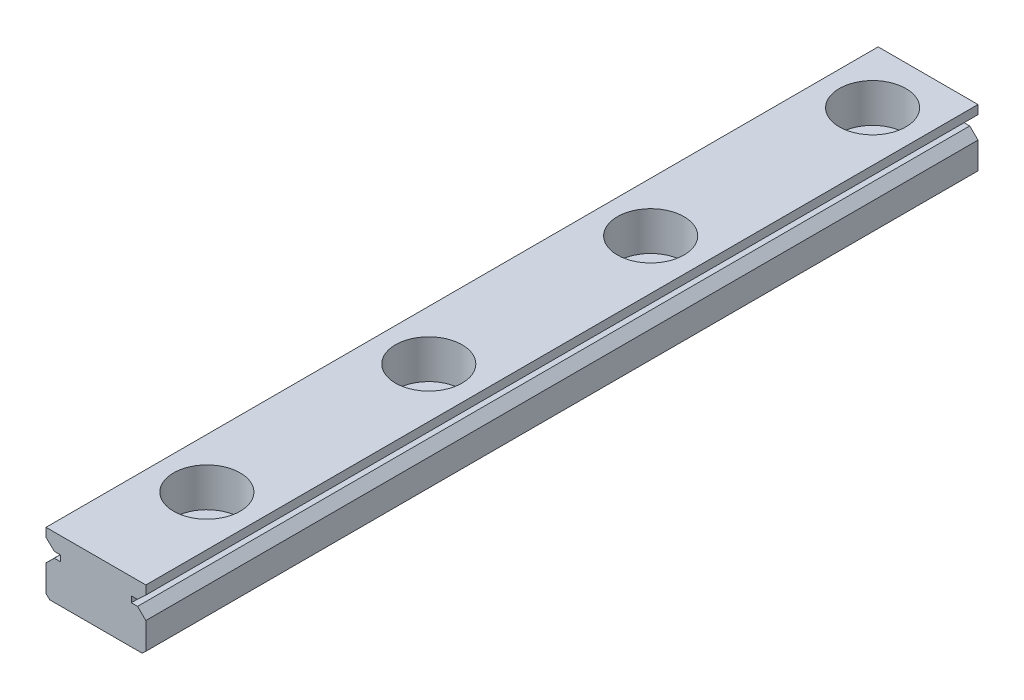
ISO-10303-21;
HEADER;
FILE_DESCRIPTION(('STEP AP214'),'2;1');
FILE_NAME('part.step','',(''),(''),'','','');
FILE_SCHEMA(('AUTOMOTIVE_DESIGN { 1 0 10303 214 1 1 1 1 }'));
ENDSEC;
DATA;
#1=APPLICATION_CONTEXT('core data for automotive mechanical design processes');
#2=APPLICATION_PROTOCOL_DEFINITION('international standard','automotive_design',2000,#1);
#3=PRODUCT_CONTEXT('',#1,'mechanical');
#4=PRODUCT('Part','Part','',(#3));
#5=PRODUCT_RELATED_PRODUCT_CATEGORY('part','',(#4));
#6=PRODUCT_DEFINITION_FORMATION('','',#4);
#7=PRODUCT_DEFINITION_CONTEXT('part definition',#1,'design');
#8=PRODUCT_DEFINITION('design','',#6,#7);
#9=PRODUCT_DEFINITION_SHAPE('','',#8);
#10=(LENGTH_UNIT() NAMED_UNIT(*) SI_UNIT(.MILLI.,.METRE.));
#11=(NAMED_UNIT(*) PLANE_ANGLE_UNIT() SI_UNIT($,.RADIAN.));
#12=(NAMED_UNIT(*) SI_UNIT($,.STERADIAN.) SOLID_ANGLE_UNIT());
#13=UNCERTAINTY_MEASURE_WITH_UNIT(LENGTH_MEASURE(1.E-05),#10,'distance_accuracy_value','');
#14=(GEOMETRIC_REPRESENTATION_CONTEXT(3) GLOBAL_UNCERTAINTY_ASSIGNED_CONTEXT((#13)) GLOBAL_UNIT_ASSIGNED_CONTEXT((#10,
#11,#12)) REPRESENTATION_CONTEXT('',''));
#15=CARTESIAN_POINT('',(0.,0.,0.));
#16=DIRECTION('',(0.,0.,1.));
#17=DIRECTION('',(1.,0.,0.));
#18=AXIS2_PLACEMENT_3D('',#15,#16,#17);
#19=CARTESIAN_POINT('',(0.,60.3558438126425,75.));
#20=DIRECTION('',(0.,-1.,0.));
#21=DIRECTION('',(0.,0.,-1.));
#22=AXIS2_PLACEMENT_3D('',#19,#20,#21);
#23=PLANE('',#22);
#24=CARTESIAN_POINT('',(176.62288373964,60.3558438126425,5.));
#25=DIRECTION('',(0.,1.,0.));
#26=DIRECTION('',(0.,0.,1.));
#27=AXIS2_PLACEMENT_3D('',#24,#25,#26);
#28=CIRCLE('',#27,3.);
#29=CARTESIAN_POINT('',(176.62288373964,60.3558438126425,8.));
#30=VERTEX_POINT('',#29);
#31=EDGE_CURVE('E352',#30,#30,#28,.T.);
#32=ORIENTED_EDGE('',*,*,#31,.F.);
#33=EDGE_LOOP('',(#32));
#34=FACE_BOUND('',#33,.T.);
#35=CARTESIAN_POINT('',(176.62288373964,60.3558438126425,25.));
#36=DIRECTION('',(0.,1.,0.));
#37=DIRECTION('',(0.,0.,1.));
#38=AXIS2_PLACEMENT_3D('',#35,#36,#37);
#39=CIRCLE('',#38,3.);
#40=CARTESIAN_POINT('',(176.62288373964,60.3558438126425,28.));
#41=VERTEX_POINT('',#40);
#42=EDGE_CURVE('E353',#41,#41,#39,.T.);
#43=ORIENTED_EDGE('',*,*,#42,.F.);
#44=EDGE_LOOP('',(#43));
#45=FACE_BOUND('',#44,.T.);
#46=CARTESIAN_POINT('',(176.62288373964,60.3558438126425,45.));
#47=DIRECTION('',(0.,1.,0.));
#48=DIRECTION('',(0.,0.,1.));
#49=AXIS2_PLACEMENT_3D('',#46,#47,#48);
#50=CIRCLE('',#49,3.);
#51=CARTESIAN_POINT('',(176.62288373964,60.3558438126425,48.));
#52=VERTEX_POINT('',#51);
#53=EDGE_CURVE('E360',#52,#52,#50,.T.);
#54=ORIENTED_EDGE('',*,*,#53,.F.);
#55=EDGE_LOOP('',(#54));
#56=FACE_BOUND('',#55,.T.);
#57=CARTESIAN_POINT('',(176.62288373964,60.3558438126425,65.));
#58=DIRECTION('',(0.,1.,0.));
#59=DIRECTION('',(0.,0.,1.));
#60=AXIS2_PLACEMENT_3D('',#57,#58,#59);
#61=CIRCLE('',#60,3.);
#62=CARTESIAN_POINT('',(176.62288373964,60.3558438126425,68.));
#63=VERTEX_POINT('',#62);
#64=EDGE_CURVE('E365',#63,#63,#61,.T.);
#65=ORIENTED_EDGE('',*,*,#64,.F.);
#66=EDGE_LOOP('',(#65));
#67=FACE_BOUND('',#66,.T.);
#68=DIRECTION('',(-1.,0.,0.));
#69=VECTOR('',#68,1.);
#70=CARTESIAN_POINT('',(0.,60.3558438126425,0.));
#71=LINE('',#70,#69);
#72=CARTESIAN_POINT('',(181.122753743396,60.3558438126425,0.));
#73=VERTEX_POINT('',#72);
#74=CARTESIAN_POINT('',(172.123013735885,60.3558438126425,0.));
#75=VERTEX_POINT('',#74);
#76=EDGE_CURVE('E191',#73,#75,#71,.T.);
#77=ORIENTED_EDGE('',*,*,#76,.T.);
#78=DIRECTION('',(0.,0.,-1.));
#79=VECTOR('',#78,1.);
#80=CARTESIAN_POINT('',(172.123013735885,60.3558438126425,75.));
#81=LINE('',#80,#79);
#82=CARTESIAN_POINT('',(172.123013735885,60.3558438126425,75.));
#83=VERTEX_POINT('',#82);
#84=EDGE_CURVE('E11',#83,#75,#81,.T.);
#85=ORIENTED_EDGE('',*,*,#84,.F.);
#86=DIRECTION('',(-1.,0.,0.));
#87=VECTOR('',#86,1.);
#88=CARTESIAN_POINT('',(0.,60.3558438126425,75.));
#89=LINE('',#88,#87);
#90=CARTESIAN_POINT('',(181.122753743396,60.3558438126425,75.));
#91=VERTEX_POINT('',#90);
#92=EDGE_CURVE('E123',#91,#83,#89,.T.);
#93=ORIENTED_EDGE('',*,*,#92,.F.);
#94=DIRECTION('',(0.,0.,-1.));
#95=VECTOR('',#94,1.);
#96=CARTESIAN_POINT('',(181.122753743396,60.3558438126425,75.));
#97=LINE('',#96,#95);
#98=EDGE_CURVE('E188',#91,#73,#97,.T.);
#99=ORIENTED_EDGE('',*,*,#98,.T.);
#100=EDGE_LOOP('',(#77,#85,#93,#99));
#101=FACE_BOUND('',#100,.T.);
#102=ADVANCED_FACE('F39',(#34,#45,#56,#67,#101),#23,.F.);
#103=CARTESIAN_POINT('',(172.123013735885,0.,75.));
#104=DIRECTION('',(-1.,0.,0.));
#105=DIRECTION('',(0.,0.,1.));
#106=AXIS2_PLACEMENT_3D('',#103,#104,#105);
#107=PLANE('',#106);
#108=DIRECTION('',(0.,1.,0.));
#109=VECTOR('',#108,1.);
#110=CARTESIAN_POINT('',(172.123013735885,0.,0.));
#111=LINE('',#110,#109);
#112=CARTESIAN_POINT('',(172.123013735885,59.5630289463369,0.));
#113=VERTEX_POINT('',#112);
#114=EDGE_CURVE('E197',#113,#75,#111,.T.);
#115=ORIENTED_EDGE('',*,*,#114,.F.);
#116=DIRECTION('',(0.,0.,-1.));
#117=VECTOR('',#116,1.);
#118=CARTESIAN_POINT('',(172.123013735885,59.5630289463369,75.));
#119=LINE('',#118,#117);
#120=CARTESIAN_POINT('',(172.123013735885,59.5630289463369,75.));
#121=VERTEX_POINT('',#120);
#122=EDGE_CURVE('E50',#121,#113,#119,.T.);
#123=ORIENTED_EDGE('',*,*,#122,.F.);
#124=DIRECTION('',(0.,1.,0.));
#125=VECTOR('',#124,1.);
#126=CARTESIAN_POINT('',(172.123013735885,0.,75.));
#127=LINE('',#126,#125);
#128=EDGE_CURVE('E288',#121,#83,#127,.T.);
#129=ORIENTED_EDGE('',*,*,#128,.T.);
#130=ORIENTED_EDGE('',*,*,#84,.T.);
#131=EDGE_LOOP('',(#115,#123,#129,#130));
#132=FACE_BOUND('',#131,.T.);
#133=ADVANCED_FACE('F280',(#132),#107,.T.);
#134=CARTESIAN_POINT('',(110.707011310501,117.452037908747,75.));
#135=DIRECTION('',(-0.685903044724634,-0.727692938839918,0.));
#136=DIRECTION('',(0.727692938839918,-0.685903044724634,0.));
#137=AXIS2_PLACEMENT_3D('',#134,#135,#136);
#138=PLANE('',#137);
#139=DIRECTION('',(-0.727692938839918,0.685903044724634,0.));
#140=VECTOR('',#139,1.);
#141=CARTESIAN_POINT('',(110.707011310501,117.452037908747,0.));
#142=LINE('',#141,#140);
#143=CARTESIAN_POINT('',(172.878991896515,58.8504650413625,0.));
#144=VERTEX_POINT('',#143);
#145=EDGE_CURVE('E204',#144,#113,#142,.T.);
#146=ORIENTED_EDGE('',*,*,#145,.F.);
#147=DIRECTION('',(0.,0.,-1.));
#148=VECTOR('',#147,1.);
#149=CARTESIAN_POINT('',(172.878991896515,58.8504650413625,75.));
#150=LINE('',#149,#148);
#151=CARTESIAN_POINT('',(172.878991896515,58.8504650413625,75.));
#152=VERTEX_POINT('',#151);
#153=EDGE_CURVE('E266',#152,#144,#150,.T.);
#154=ORIENTED_EDGE('',*,*,#153,.F.);
#155=DIRECTION('',(-0.727692938839918,0.685903044724634,0.));
#156=VECTOR('',#155,1.);
#157=CARTESIAN_POINT('',(110.707011310501,117.452037908747,75.));
#158=LINE('',#157,#156);
#159=EDGE_CURVE('E274',#152,#121,#158,.T.);
#160=ORIENTED_EDGE('',*,*,#159,.T.);
#161=ORIENTED_EDGE('',*,*,#122,.T.);
#162=EDGE_LOOP('',(#146,#154,#160,#161));
#163=FACE_BOUND('',#162,.T.);
#164=ADVANCED_FACE('F275',(#163),#138,.T.);
#165=CARTESIAN_POINT('',(0.,58.8504650413625,75.));
#166=DIRECTION('',(0.,-1.,0.));
#167=DIRECTION('',(0.,0.,-1.));
#168=AXIS2_PLACEMENT_3D('',#165,#166,#167);
#169=PLANE('',#168);
#170=DIRECTION('',(-1.,0.,0.));
#171=VECTOR('',#170,1.);
#172=CARTESIAN_POINT('',(0.,58.8504650413625,0.));
#173=LINE('',#172,#171);
#174=CARTESIAN_POINT('',(173.430975950309,58.8504650413625,0.));
#175=VERTEX_POINT('',#174);
#176=EDGE_CURVE('E203',#175,#144,#173,.T.);
#177=ORIENTED_EDGE('',*,*,#176,.F.);
#178=DIRECTION('',(0.,0.,-1.));
#179=VECTOR('',#178,1.);
#180=CARTESIAN_POINT('',(173.430975950309,58.8504650413625,75.));
#181=LINE('',#180,#179);
#182=CARTESIAN_POINT('',(173.430975950309,58.8504650413625,75.));
#183=VERTEX_POINT('',#182);
#184=EDGE_CURVE('E265',#183,#175,#181,.T.);
#185=ORIENTED_EDGE('',*,*,#184,.F.);
#186=DIRECTION('',(-1.,0.,0.));
#187=VECTOR('',#186,1.);
#188=CARTESIAN_POINT('',(0.,58.8504650413625,75.));
#189=LINE('',#188,#187);
#190=EDGE_CURVE('E290',#183,#152,#189,.T.);
#191=ORIENTED_EDGE('',*,*,#190,.T.);
#192=ORIENTED_EDGE('',*,*,#153,.T.);
#193=EDGE_LOOP('',(#177,#185,#191,#192));
#194=FACE_BOUND('',#193,.T.);
#195=ADVANCED_FACE('F283',(#194),#169,.T.);
#196=CARTESIAN_POINT('',(173.430975950309,0.,75.));
#197=DIRECTION('',(-1.,0.,0.));
#198=DIRECTION('',(0.,0.,1.));
#199=AXIS2_PLACEMENT_3D('',#196,#197,#198);
#200=PLANE('',#199);
#201=DIRECTION('',(0.,1.,0.));
#202=VECTOR('',#201,1.);
#203=CARTESIAN_POINT('',(173.430975950309,0.,0.));
#204=LINE('',#203,#202);
#205=CARTESIAN_POINT('',(173.430975950309,58.3136633089681,0.));
#206=VERTEX_POINT('',#205);
#207=EDGE_CURVE('E210',#206,#175,#204,.T.);
#208=ORIENTED_EDGE('',*,*,#207,.F.);
#209=DIRECTION('',(0.,0.,-1.));
#210=VECTOR('',#209,1.);
#211=CARTESIAN_POINT('',(173.430975950309,58.3136633089681,75.));
#212=LINE('',#211,#210);
#213=CARTESIAN_POINT('',(173.430975950309,58.3136633089681,75.));
#214=VERTEX_POINT('',#213);
#215=EDGE_CURVE('E264',#214,#206,#212,.T.);
#216=ORIENTED_EDGE('',*,*,#215,.F.);
#217=DIRECTION('',(0.,1.,0.));
#218=VECTOR('',#217,1.);
#219=CARTESIAN_POINT('',(173.430975950309,0.,75.));
#220=LINE('',#219,#218);
#221=EDGE_CURVE('E292',#214,#183,#220,.T.);
#222=ORIENTED_EDGE('',*,*,#221,.T.);
#223=ORIENTED_EDGE('',*,*,#184,.T.);
#224=EDGE_LOOP('',(#208,#216,#222,#223));
#225=FACE_BOUND('',#224,.T.);
#226=ADVANCED_FACE('F413',(#225),#200,.T.);
#227=CARTESIAN_POINT('',(0.,58.3136633089681,75.));
#228=DIRECTION('',(0.,1.,0.));
#229=DIRECTION('',(0.,0.,1.));
#230=AXIS2_PLACEMENT_3D('',#227,#228,#229);
#231=PLANE('',#230);
#232=DIRECTION('',(1.,0.,0.));
#233=VECTOR('',#232,1.);
#234=CARTESIAN_POINT('',(0.,58.3136633089681,0.));
#235=LINE('',#234,#233);
#236=CARTESIAN_POINT('',(172.866992243172,58.3136633089681,0.));
#237=VERTEX_POINT('',#236);
#238=EDGE_CURVE('E208',#237,#206,#235,.T.);
#239=ORIENTED_EDGE('',*,*,#238,.F.);
#240=DIRECTION('',(0.,0.,-1.));
#241=VECTOR('',#240,1.);
#242=CARTESIAN_POINT('',(172.866992243172,58.3136633089681,75.));
#243=LINE('',#242,#241);
#244=CARTESIAN_POINT('',(172.866992243172,58.3136633089681,75.));
#245=VERTEX_POINT('',#244);
#246=EDGE_CURVE('E261',#245,#237,#243,.T.);
#247=ORIENTED_EDGE('',*,*,#246,.F.);
#248=DIRECTION('',(1.,0.,0.));
#249=VECTOR('',#248,1.);
#250=CARTESIAN_POINT('',(0.,58.3136633089681,75.));
#251=LINE('',#250,#249);
#252=EDGE_CURVE('E296',#245,#214,#251,.T.);
#253=ORIENTED_EDGE('',*,*,#252,.T.);
#254=ORIENTED_EDGE('',*,*,#215,.T.);
#255=EDGE_LOOP('',(#239,#247,#253,#254));
#256=FACE_BOUND('',#255,.T.);
#257=ADVANCED_FACE('F411',(#256),#231,.T.);
#258=CARTESIAN_POINT('',(56.2293907047499,-56.9162890040398,75.));
#259=DIRECTION('',(-0.702801041807441,0.711386460114596,0.));
#260=DIRECTION('',(-0.711386460114596,-0.702801041807441,0.));
#261=AXIS2_PLACEMENT_3D('',#258,#259,#260);
#262=PLANE('',#261);
#263=DIRECTION('',(0.711386460114596,0.702801041807441,0.));
#264=VECTOR('',#263,1.);
#265=CARTESIAN_POINT('',(56.2293907047499,-56.9162890040398,0.));
#266=LINE('',#265,#264);
#267=CARTESIAN_POINT('',(172.123013735885,57.5786635594371,0.));
#268=VERTEX_POINT('',#267);
#269=EDGE_CURVE('E214',#268,#237,#266,.T.);
#270=ORIENTED_EDGE('',*,*,#269,.F.);
#271=DIRECTION('',(0.,0.,-1.));
#272=VECTOR('',#271,1.);
#273=CARTESIAN_POINT('',(172.123013735885,57.5786635594371,75.));
#274=LINE('',#273,#272);
#275=CARTESIAN_POINT('',(172.123013735885,57.5786635594371,75.));
#276=VERTEX_POINT('',#275);
#277=EDGE_CURVE('E256',#276,#268,#274,.T.);
#278=ORIENTED_EDGE('',*,*,#277,.F.);
#279=DIRECTION('',(0.711386460114596,0.702801041807441,0.));
#280=VECTOR('',#279,1.);
#281=CARTESIAN_POINT('',(56.2293907047499,-56.9162890040398,75.));
#282=LINE('',#281,#280);
#283=EDGE_CURVE('E301',#276,#245,#282,.T.);
#284=ORIENTED_EDGE('',*,*,#283,.T.);
#285=ORIENTED_EDGE('',*,*,#246,.T.);
#286=EDGE_LOOP('',(#270,#278,#284,#285));
#287=FACE_BOUND('',#286,.T.);
#288=ADVANCED_FACE('F409',(#287),#262,.T.);
#289=CARTESIAN_POINT('',(172.123013735885,0.,75.));
#290=DIRECTION('',(-1.,0.,0.));
#291=DIRECTION('',(0.,0.,1.));
#292=AXIS2_PLACEMENT_3D('',#289,#290,#291);
#293=PLANE('',#292);
#294=DIRECTION('',(0.,1.,0.));
#295=VECTOR('',#294,1.);
#296=CARTESIAN_POINT('',(172.123013735885,0.,0.));
#297=LINE('',#296,#295);
#298=CARTESIAN_POINT('',(172.123013735885,55.1745401347487,0.));
#299=VERTEX_POINT('',#298);
#300=EDGE_CURVE('E216',#299,#268,#297,.T.);
#301=ORIENTED_EDGE('',*,*,#300,.F.);
#302=DIRECTION('',(0.,0.,-1.));
#303=VECTOR('',#302,1.);
#304=CARTESIAN_POINT('',(172.123013735885,55.1745401347487,75.));
#305=LINE('',#304,#303);
#306=CARTESIAN_POINT('',(172.123013735885,55.1745401347487,75.));
#307=VERTEX_POINT('',#306);
#308=EDGE_CURVE('E260',#307,#299,#305,.T.);
#309=ORIENTED_EDGE('',*,*,#308,.F.);
#310=DIRECTION('',(0.,1.,0.));
#311=VECTOR('',#310,1.);
#312=CARTESIAN_POINT('',(172.123013735885,0.,75.));
#313=LINE('',#312,#311);
#314=EDGE_CURVE('E302',#307,#276,#313,.T.);
#315=ORIENTED_EDGE('',*,*,#314,.T.);
#316=ORIENTED_EDGE('',*,*,#277,.T.);
#317=EDGE_LOOP('',(#301,#309,#315,#316));
#318=FACE_BOUND('',#317,.T.);
#319=ADVANCED_FACE('F403',(#318),#293,.T.);
#320=CARTESIAN_POINT('',(105.735463596551,115.794842649279,75.));
#321=DIRECTION('',(0.674303230167207,0.738454571240554,0.));
#322=DIRECTION('',(-0.738454571240554,0.674303230167207,0.));
#323=AXIS2_PLACEMENT_3D('',#320,#321,#322);
#324=PLANE('',#323);
#325=DIRECTION('',(0.738454571240554,-0.674303230167207,0.));
#326=VECTOR('',#325,1.);
#327=CARTESIAN_POINT('',(105.735463596551,115.794842649279,0.));
#328=LINE('',#327,#326);
#329=CARTESIAN_POINT('',(172.467003798394,54.8604333239455,0.));
#330=VERTEX_POINT('',#329);
#331=EDGE_CURVE('E218',#299,#330,#328,.T.);
#332=ORIENTED_EDGE('',*,*,#331,.T.);
#333=DIRECTION('',(0.,0.,-1.));
#334=VECTOR('',#333,1.);
#335=CARTESIAN_POINT('',(172.467003798394,54.8604333239455,75.));
#336=LINE('',#335,#334);
#337=CARTESIAN_POINT('',(172.467003798394,54.8604333239455,75.));
#338=VERTEX_POINT('',#337);
#339=EDGE_CURVE('E253',#338,#330,#336,.T.);
#340=ORIENTED_EDGE('',*,*,#339,.F.);
#341=DIRECTION('',(0.738454571240554,-0.674303230167207,0.));
#342=VECTOR('',#341,1.);
#343=CARTESIAN_POINT('',(105.735463596551,115.794842649279,75.));
#344=LINE('',#343,#342);
#345=EDGE_CURVE('E310',#307,#338,#344,.T.);
#346=ORIENTED_EDGE('',*,*,#345,.F.);
#347=ORIENTED_EDGE('',*,*,#308,.T.);
#348=EDGE_LOOP('',(#332,#340,#346,#347));
#349=FACE_BOUND('',#348,.T.);
#350=ADVANCED_FACE('F383',(#349),#324,.F.);
#351=CARTESIAN_POINT('',(0.,54.8604333239455,75.));
#352=DIRECTION('',(0.,-1.,0.));
#353=DIRECTION('',(0.,0.,-1.));
#354=AXIS2_PLACEMENT_3D('',#351,#352,#353);
#355=PLANE('',#354);
#356=CARTESIAN_POINT('',(176.62288373964,54.8604333239455,5.));
#357=DIRECTION('',(0.,-1.,0.));
#358=DIRECTION('',(0.,0.,-1.));
#359=AXIS2_PLACEMENT_3D('',#356,#357,#358);
#360=CIRCLE('',#359,1.75);
#361=CARTESIAN_POINT('',(176.62288373964,54.8604333239455,3.25));
#362=VERTEX_POINT('',#361);
#363=EDGE_CURVE('E655',#362,#362,#360,.T.);
#364=ORIENTED_EDGE('',*,*,#363,.F.);
#365=EDGE_LOOP('',(#364));
#366=FACE_BOUND('',#365,.T.);
#367=CARTESIAN_POINT('',(176.62288373964,54.8604333239455,25.));
#368=DIRECTION('',(0.,-1.,0.));
#369=DIRECTION('',(0.,0.,-1.));
#370=AXIS2_PLACEMENT_3D('',#367,#368,#369);
#371=CIRCLE('',#370,1.75);
#372=CARTESIAN_POINT('',(176.62288373964,54.8604333239455,23.25));
#373=VERTEX_POINT('',#372);
#374=EDGE_CURVE('E663',#373,#373,#371,.T.);
#375=ORIENTED_EDGE('',*,*,#374,.F.);
#376=EDGE_LOOP('',(#375));
#377=FACE_BOUND('',#376,.T.);
#378=CARTESIAN_POINT('',(176.62288373964,54.8604333239455,45.));
#379=DIRECTION('',(0.,-1.,0.));
#380=DIRECTION('',(0.,0.,-1.));
#381=AXIS2_PLACEMENT_3D('',#378,#379,#380);
#382=CIRCLE('',#381,1.75);
#383=CARTESIAN_POINT('',(176.62288373964,54.8604333239455,43.25));
#384=VERTEX_POINT('',#383);
#385=EDGE_CURVE('E362',#384,#384,#382,.T.);
#386=ORIENTED_EDGE('',*,*,#385,.F.);
#387=EDGE_LOOP('',(#386));
#388=FACE_BOUND('',#387,.T.);
#389=CARTESIAN_POINT('',(176.62288373964,54.8604333239455,65.));
#390=DIRECTION('',(0.,-1.,0.));
#391=DIRECTION('',(0.,0.,-1.));
#392=AXIS2_PLACEMENT_3D('',#389,#390,#391);
#393=CIRCLE('',#392,1.75);
#394=CARTESIAN_POINT('',(176.62288373964,54.8604333239455,63.25));
#395=VERTEX_POINT('',#394);
#396=EDGE_CURVE('E199',#395,#395,#393,.T.);
#397=ORIENTED_EDGE('',*,*,#396,.F.);
#398=EDGE_LOOP('',(#397));
#399=FACE_BOUND('',#398,.T.);
#400=DIRECTION('',(-1.,0.,0.));
#401=VECTOR('',#400,1.);
#402=CARTESIAN_POINT('',(0.,54.8604333239455,0.));
#403=LINE('',#402,#401);
#404=CARTESIAN_POINT('',(180.778763680886,54.8604333239455,0.));
#405=VERTEX_POINT('',#404);
#406=EDGE_CURVE('E225',#405,#330,#403,.T.);
#407=ORIENTED_EDGE('',*,*,#406,.F.);
#408=DIRECTION('',(0.,0.,-1.));
#409=VECTOR('',#408,1.);
#410=CARTESIAN_POINT('',(180.778763680886,54.8604333239455,75.));
#411=LINE('',#410,#409);
#412=CARTESIAN_POINT('',(180.778763680886,54.8604333239455,75.));
#413=VERTEX_POINT('',#412);
#414=EDGE_CURVE('E254',#413,#405,#411,.T.);
#415=ORIENTED_EDGE('',*,*,#414,.F.);
#416=DIRECTION('',(-1.,0.,0.));
#417=VECTOR('',#416,1.);
#418=CARTESIAN_POINT('',(0.,54.8604333239455,75.));
#419=LINE('',#418,#417);
#420=EDGE_CURVE('E307',#413,#338,#419,.T.);
#421=ORIENTED_EDGE('',*,*,#420,.T.);
#422=ORIENTED_EDGE('',*,*,#339,.T.);
#423=EDGE_LOOP('',(#407,#415,#421,#422));
#424=FACE_BOUND('',#423,.T.);
#425=ADVANCED_FACE('F385',(#366,#377,#388,#399,#424),#355,.T.);
#426=CARTESIAN_POINT('',(54.880033865487,-60.101168235181,75.));
#427=DIRECTION('',(0.674303230167207,-0.738454571240554,0.));
#428=DIRECTION('',(0.738454571240554,0.674303230167207,0.));
#429=AXIS2_PLACEMENT_3D('',#426,#427,#428);
#430=PLANE('',#429);
#431=DIRECTION('',(-0.738454571240554,-0.674303230167207,0.));
#432=VECTOR('',#431,1.);
#433=CARTESIAN_POINT('',(54.880033865487,-60.101168235181,0.));
#434=LINE('',#433,#432);
#435=CARTESIAN_POINT('',(181.122753743396,55.1745401347487,0.));
#436=VERTEX_POINT('',#435);
#437=EDGE_CURVE('E223',#436,#405,#434,.T.);
#438=ORIENTED_EDGE('',*,*,#437,.F.);
#439=DIRECTION('',(0.,0.,-1.));
#440=VECTOR('',#439,1.);
#441=CARTESIAN_POINT('',(181.122753743396,55.1745401347487,75.));
#442=LINE('',#441,#440);
#443=CARTESIAN_POINT('',(181.122753743396,55.1745401347487,75.));
#444=VERTEX_POINT('',#443);
#445=EDGE_CURVE('E252',#444,#436,#442,.T.);
#446=ORIENTED_EDGE('',*,*,#445,.F.);
#447=DIRECTION('',(-0.738454571240554,-0.674303230167207,0.));
#448=VECTOR('',#447,1.);
#449=CARTESIAN_POINT('',(54.880033865487,-60.101168235181,75.));
#450=LINE('',#449,#448);
#451=EDGE_CURVE('E315',#444,#413,#450,.T.);
#452=ORIENTED_EDGE('',*,*,#451,.T.);
#453=ORIENTED_EDGE('',*,*,#414,.T.);
#454=EDGE_LOOP('',(#438,#446,#452,#453));
#455=FACE_BOUND('',#454,.T.);
#456=ADVANCED_FACE('F381',(#455),#430,.T.);
#457=CARTESIAN_POINT('',(181.122753743396,0.,75.));
#458=DIRECTION('',(-1.,0.,0.));
#459=DIRECTION('',(0.,0.,1.));
#460=AXIS2_PLACEMENT_3D('',#457,#458,#459);
#461=PLANE('',#460);
#462=DIRECTION('',(0.,1.,0.));
#463=VECTOR('',#462,1.);
#464=CARTESIAN_POINT('',(181.122753743396,0.,0.));
#465=LINE('',#464,#463);
#466=CARTESIAN_POINT('',(181.122753743396,57.5786635594371,0.));
#467=VERTEX_POINT('',#466);
#468=EDGE_CURVE('E226',#436,#467,#465,.T.);
#469=ORIENTED_EDGE('',*,*,#468,.T.);
#470=DIRECTION('',(0.,0.,-1.));
#471=VECTOR('',#470,1.);
#472=CARTESIAN_POINT('',(181.122753743396,57.5786635594371,75.));
#473=LINE('',#472,#471);
#474=CARTESIAN_POINT('',(181.122753743396,57.5786635594371,75.));
#475=VERTEX_POINT('',#474);
#476=EDGE_CURVE('E247',#475,#467,#473,.T.);
#477=ORIENTED_EDGE('',*,*,#476,.F.);
#478=DIRECTION('',(0.,1.,0.));
#479=VECTOR('',#478,1.);
#480=CARTESIAN_POINT('',(181.122753743396,0.,75.));
#481=LINE('',#480,#479);
#482=EDGE_CURVE('E314',#444,#475,#481,.T.);
#483=ORIENTED_EDGE('',*,*,#482,.F.);
#484=ORIENTED_EDGE('',*,*,#445,.T.);
#485=EDGE_LOOP('',(#469,#477,#483,#484));
#486=FACE_BOUND('',#485,.T.);
#487=ADVANCED_FACE('F475',(#486),#461,.F.);
#488=CARTESIAN_POINT('',(118.249294646824,119.693500080728,75.));
#489=DIRECTION('',(-0.702802016691502,-0.711385496994673,0.));
#490=DIRECTION('',(0.711385496994673,-0.702802016691502,0.));
#491=AXIS2_PLACEMENT_3D('',#488,#489,#490);
#492=PLANE('',#491);
#493=DIRECTION('',(-0.711385496994673,0.702802016691502,0.));
#494=VECTOR('',#493,1.);
#495=CARTESIAN_POINT('',(118.249294646824,119.693500080728,0.));
#496=LINE('',#495,#494);
#497=CARTESIAN_POINT('',(180.378777275353,58.3136633089681,0.));
#498=VERTEX_POINT('',#497);
#499=EDGE_CURVE('E229',#467,#498,#496,.T.);
#500=ORIENTED_EDGE('',*,*,#499,.T.);
#501=DIRECTION('',(0.,0.,-1.));
#502=VECTOR('',#501,1.);
#503=CARTESIAN_POINT('',(180.378777275353,58.3136633089681,75.));
#504=LINE('',#503,#502);
#505=CARTESIAN_POINT('',(180.378777275353,58.3136633089681,75.));
#506=VERTEX_POINT('',#505);
#507=EDGE_CURVE('E244',#506,#498,#504,.T.);
#508=ORIENTED_EDGE('',*,*,#507,.F.);
#509=DIRECTION('',(-0.711385496994673,0.702802016691502,0.));
#510=VECTOR('',#509,1.);
#511=CARTESIAN_POINT('',(118.249294646824,119.693500080728,75.));
#512=LINE('',#511,#510);
#513=EDGE_CURVE('E320',#475,#506,#512,.T.);
#514=ORIENTED_EDGE('',*,*,#513,.F.);
#515=ORIENTED_EDGE('',*,*,#476,.T.);
#516=EDGE_LOOP('',(#500,#508,#514,#515));
#517=FACE_BOUND('',#516,.T.);
#518=ADVANCED_FACE('F478',(#517),#492,.F.);
#519=CARTESIAN_POINT('',(0.,58.3136633089681,75.));
#520=DIRECTION('',(0.,-1.,0.));
#521=DIRECTION('',(0.,0.,-1.));
#522=AXIS2_PLACEMENT_3D('',#519,#520,#521);
#523=PLANE('',#522);
#524=DIRECTION('',(-1.,0.,0.));
#525=VECTOR('',#524,1.);
#526=CARTESIAN_POINT('',(0.,58.3136633089681,0.));
#527=LINE('',#526,#525);
#528=CARTESIAN_POINT('',(179.81479152897,58.3136633089681,0.));
#529=VERTEX_POINT('',#528);
#530=EDGE_CURVE('E235',#498,#529,#527,.T.);
#531=ORIENTED_EDGE('',*,*,#530,.T.);
#532=DIRECTION('',(0.,0.,-1.));
#533=VECTOR('',#532,1.);
#534=CARTESIAN_POINT('',(179.81479152897,58.3136633089681,75.));
#535=LINE('',#534,#533);
#536=CARTESIAN_POINT('',(179.81479152897,58.3136633089681,75.));
#537=VERTEX_POINT('',#536);
#538=EDGE_CURVE('E245',#537,#529,#535,.T.);
#539=ORIENTED_EDGE('',*,*,#538,.F.);
#540=DIRECTION('',(-1.,0.,0.));
#541=VECTOR('',#540,1.);
#542=CARTESIAN_POINT('',(0.,58.3136633089681,75.));
#543=LINE('',#542,#541);
#544=EDGE_CURVE('E316',#506,#537,#543,.T.);
#545=ORIENTED_EDGE('',*,*,#544,.F.);
#546=ORIENTED_EDGE('',*,*,#507,.T.);
#547=EDGE_LOOP('',(#531,#539,#545,#546));
#548=FACE_BOUND('',#547,.T.);
#549=ADVANCED_FACE('F323',(#548),#523,.F.);
#550=CARTESIAN_POINT('',(179.81479152897,0.,75.));
#551=DIRECTION('',(-1.,0.,0.));
#552=DIRECTION('',(0.,0.,1.));
#553=AXIS2_PLACEMENT_3D('',#550,#551,#552);
#554=PLANE('',#553);
#555=DIRECTION('',(0.,1.,0.));
#556=VECTOR('',#555,1.);
#557=CARTESIAN_POINT('',(179.81479152897,0.,0.));
#558=LINE('',#557,#556);
#559=CARTESIAN_POINT('',(179.81479152897,58.8504650413625,0.));
#560=VERTEX_POINT('',#559);
#561=EDGE_CURVE('E234',#529,#560,#558,.T.);
#562=ORIENTED_EDGE('',*,*,#561,.T.);
#563=DIRECTION('',(0.,0.,-1.));
#564=VECTOR('',#563,1.);
#565=CARTESIAN_POINT('',(179.81479152897,58.8504650413625,75.));
#566=LINE('',#565,#564);
#567=CARTESIAN_POINT('',(179.81479152897,58.8504650413625,75.));
#568=VERTEX_POINT('',#567);
#569=EDGE_CURVE('E184',#568,#560,#566,.T.);
#570=ORIENTED_EDGE('',*,*,#569,.F.);
#571=DIRECTION('',(0.,1.,0.));
#572=VECTOR('',#571,1.);
#573=CARTESIAN_POINT('',(179.81479152897,0.,75.));
#574=LINE('',#573,#572);
#575=EDGE_CURVE('E176',#537,#568,#574,.T.);
#576=ORIENTED_EDGE('',*,*,#575,.F.);
#577=ORIENTED_EDGE('',*,*,#538,.T.);
#578=EDGE_LOOP('',(#562,#570,#576,#577));
#579=FACE_BOUND('',#578,.T.);
#580=ADVANCED_FACE('F328',(#579),#554,.F.);
#581=CARTESIAN_POINT('',(0.,58.8504650413625,75.));
#582=DIRECTION('',(0.,1.,0.));
#583=DIRECTION('',(0.,0.,1.));
#584=AXIS2_PLACEMENT_3D('',#581,#582,#583);
#585=PLANE('',#584);
#586=DIRECTION('',(1.,0.,0.));
#587=VECTOR('',#586,1.);
#588=CARTESIAN_POINT('',(0.,58.8504650413625,0.));
#589=LINE('',#588,#587);
#590=CARTESIAN_POINT('',(180.366775582764,58.8504650413625,0.));
#591=VERTEX_POINT('',#590);
#592=EDGE_CURVE('E183',#560,#591,#589,.T.);
#593=ORIENTED_EDGE('',*,*,#592,.T.);
#594=DIRECTION('',(0.,0.,-1.));
#595=VECTOR('',#594,1.);
#596=CARTESIAN_POINT('',(180.366775582764,58.8504650413625,75.));
#597=LINE('',#596,#595);
#598=CARTESIAN_POINT('',(180.366775582764,58.8504650413625,75.));
#599=VERTEX_POINT('',#598);
#600=EDGE_CURVE('E181',#599,#591,#597,.T.);
#601=ORIENTED_EDGE('',*,*,#600,.F.);
#602=DIRECTION('',(1.,0.,0.));
#603=VECTOR('',#602,1.);
#604=CARTESIAN_POINT('',(0.,58.8504650413625,75.));
#605=LINE('',#604,#603);
#606=EDGE_CURVE('E167',#568,#599,#605,.T.);
#607=ORIENTED_EDGE('',*,*,#606,.F.);
#608=ORIENTED_EDGE('',*,*,#569,.T.);
#609=EDGE_LOOP('',(#593,#601,#607,#608));
#610=FACE_BOUND('',#609,.T.);
#611=ADVANCED_FACE('F185',(#610),#585,.F.);
#612=CARTESIAN_POINT('',(55.4820475190048,-58.8623924656534,75.));
#613=DIRECTION('',(-0.685903044724567,0.727692938839981,0.));
#614=DIRECTION('',(-0.727692938839981,-0.685903044724567,0.));
#615=AXIS2_PLACEMENT_3D('',#612,#613,#614);
#616=PLANE('',#615);
#617=DIRECTION('',(0.727692938839981,0.685903044724567,0.));
#618=VECTOR('',#617,1.);
#619=CARTESIAN_POINT('',(55.4820475190048,-58.8623924656534,0.));
#620=LINE('',#619,#618);
#621=CARTESIAN_POINT('',(181.122753743396,59.5630289463369,0.));
#622=VERTEX_POINT('',#621);
#623=EDGE_CURVE('E113',#591,#622,#620,.T.);
#624=ORIENTED_EDGE('',*,*,#623,.T.);
#625=DIRECTION('',(0.,0.,-1.));
#626=VECTOR('',#625,1.);
#627=CARTESIAN_POINT('',(181.122753743396,59.5630289463369,75.));
#628=LINE('',#627,#626);
#629=CARTESIAN_POINT('',(181.122753743396,59.5630289463369,75.));
#630=VERTEX_POINT('',#629);
#631=EDGE_CURVE('E187',#630,#622,#628,.T.);
#632=ORIENTED_EDGE('',*,*,#631,.F.);
#633=DIRECTION('',(0.727692938839981,0.685903044724567,0.));
#634=VECTOR('',#633,1.);
#635=CARTESIAN_POINT('',(55.4820475190048,-58.8623924656534,75.));
#636=LINE('',#635,#634);
#637=EDGE_CURVE('E172',#599,#630,#636,.T.);
#638=ORIENTED_EDGE('',*,*,#637,.F.);
#639=ORIENTED_EDGE('',*,*,#600,.T.);
#640=EDGE_LOOP('',(#624,#632,#638,#639));
#641=FACE_BOUND('',#640,.T.);
#642=ADVANCED_FACE('F189',(#641),#616,.F.);
#643=CARTESIAN_POINT('',(181.122753743396,0.,75.));
#644=DIRECTION('',(-1.,0.,0.));
#645=DIRECTION('',(0.,0.,1.));
#646=AXIS2_PLACEMENT_3D('',#643,#644,#645);
#647=PLANE('',#646);
#648=DIRECTION('',(0.,1.,0.));
#649=VECTOR('',#648,1.);
#650=CARTESIAN_POINT('',(181.122753743396,0.,0.));
#651=LINE('',#650,#649);
#652=EDGE_CURVE('E118',#622,#73,#651,.T.);
#653=ORIENTED_EDGE('',*,*,#652,.T.);
#654=ORIENTED_EDGE('',*,*,#98,.F.);
#655=DIRECTION('',(0.,1.,0.));
#656=VECTOR('',#655,1.);
#657=CARTESIAN_POINT('',(181.122753743396,0.,75.));
#658=LINE('',#657,#656);
#659=EDGE_CURVE('E54',#630,#91,#658,.T.);
#660=ORIENTED_EDGE('',*,*,#659,.F.);
#661=ORIENTED_EDGE('',*,*,#631,.T.);
#662=EDGE_LOOP('',(#653,#654,#660,#661));
#663=FACE_BOUND('',#662,.T.);
#664=ADVANCED_FACE('F334',(#663),#647,.F.);
#665=CARTESIAN_POINT('',(0.,0.,75.));
#666=DIRECTION('',(0.,0.,1.));
#667=DIRECTION('',(1.,0.,0.));
#668=AXIS2_PLACEMENT_3D('',#665,#666,#667);
#669=PLANE('',#668);
#670=ORIENTED_EDGE('',*,*,#92,.T.);
#671=ORIENTED_EDGE('',*,*,#128,.F.);
#672=ORIENTED_EDGE('',*,*,#159,.F.);
#673=ORIENTED_EDGE('',*,*,#190,.F.);
#674=ORIENTED_EDGE('',*,*,#221,.F.);
#675=ORIENTED_EDGE('',*,*,#252,.F.);
#676=ORIENTED_EDGE('',*,*,#283,.F.);
#677=ORIENTED_EDGE('',*,*,#314,.F.);
#678=ORIENTED_EDGE('',*,*,#345,.T.);
#679=ORIENTED_EDGE('',*,*,#420,.F.);
#680=ORIENTED_EDGE('',*,*,#451,.F.);
#681=ORIENTED_EDGE('',*,*,#482,.T.);
#682=ORIENTED_EDGE('',*,*,#513,.T.);
#683=ORIENTED_EDGE('',*,*,#544,.T.);
#684=ORIENTED_EDGE('',*,*,#575,.T.);
#685=ORIENTED_EDGE('',*,*,#606,.T.);
#686=ORIENTED_EDGE('',*,*,#637,.T.);
#687=ORIENTED_EDGE('',*,*,#659,.T.);
#688=EDGE_LOOP('',(#670,#671,#672,#673,#674,#675,#676,#677,#678,#679,#680,#681,#682,#683,#684,
#685,#686,#687));
#689=FACE_BOUND('',#688,.T.);
#690=ADVANCED_FACE('F175',(#689),#669,.T.);
#691=CARTESIAN_POINT('',(0.,0.,0.));
#692=DIRECTION('',(0.,0.,1.));
#693=DIRECTION('',(1.,0.,0.));
#694=AXIS2_PLACEMENT_3D('',#691,#692,#693);
#695=PLANE('',#694);
#696=ORIENTED_EDGE('',*,*,#76,.F.);
#697=ORIENTED_EDGE('',*,*,#652,.F.);
#698=ORIENTED_EDGE('',*,*,#623,.F.);
#699=ORIENTED_EDGE('',*,*,#592,.F.);
#700=ORIENTED_EDGE('',*,*,#561,.F.);
#701=ORIENTED_EDGE('',*,*,#530,.F.);
#702=ORIENTED_EDGE('',*,*,#499,.F.);
#703=ORIENTED_EDGE('',*,*,#468,.F.);
#704=ORIENTED_EDGE('',*,*,#437,.T.);
#705=ORIENTED_EDGE('',*,*,#406,.T.);
#706=ORIENTED_EDGE('',*,*,#331,.F.);
#707=ORIENTED_EDGE('',*,*,#300,.T.);
#708=ORIENTED_EDGE('',*,*,#269,.T.);
#709=ORIENTED_EDGE('',*,*,#238,.T.);
#710=ORIENTED_EDGE('',*,*,#207,.T.);
#711=ORIENTED_EDGE('',*,*,#176,.T.);
#712=ORIENTED_EDGE('',*,*,#145,.T.);
#713=ORIENTED_EDGE('',*,*,#114,.T.);
#714=EDGE_LOOP('',(#696,#697,#698,#699,#700,#701,#702,#703,#704,#705,#706,#707,#708,#709,#710,
#711,#712,#713));
#715=FACE_BOUND('',#714,.T.);
#716=ADVANCED_FACE('F278',(#715),#695,.F.);
#717=CARTESIAN_POINT('',(176.62288373964,60.3558438126425,65.));
#718=DIRECTION('',(0.,1.,0.));
#719=DIRECTION('',(0.,0.,1.));
#720=AXIS2_PLACEMENT_3D('',#717,#718,#719);
#721=CYLINDRICAL_SURFACE('',#720,1.75);
#722=CARTESIAN_POINT('',(176.62288373964,56.8558438126425,65.));
#723=DIRECTION('',(0.,1.,0.));
#724=DIRECTION('',(0.,0.,1.));
#725=AXIS2_PLACEMENT_3D('',#722,#723,#724);
#726=CIRCLE('',#725,1.75);
#727=CARTESIAN_POINT('',(176.62288373964,56.8558438126425,66.75));
#728=VERTEX_POINT('',#727);
#729=EDGE_CURVE('E368',#728,#728,#726,.T.);
#730=ORIENTED_EDGE('',*,*,#729,.T.);
#731=EDGE_LOOP('',(#730));
#732=FACE_BOUND('',#731,.T.);
#733=ORIENTED_EDGE('',*,*,#396,.T.);
#734=EDGE_LOOP('',(#733));
#735=FACE_BOUND('',#734,.T.);
#736=ADVANCED_FACE('F379',(#732,#735),#721,.F.);
#737=CARTESIAN_POINT('',(178.37288373964,56.8558438126425,65.));
#738=DIRECTION('',(0.,-1.,0.));
#739=DIRECTION('',(0.,0.,-1.));
#740=AXIS2_PLACEMENT_3D('',#737,#738,#739);
#741=PLANE('',#740);
#742=ORIENTED_EDGE('',*,*,#729,.F.);
#743=EDGE_LOOP('',(#742));
#744=FACE_BOUND('',#743,.T.);
#745=CARTESIAN_POINT('',(176.62288373964,56.8558438126425,65.));
#746=DIRECTION('',(0.,1.,0.));
#747=DIRECTION('',(0.,0.,1.));
#748=AXIS2_PLACEMENT_3D('',#745,#746,#747);
#749=CIRCLE('',#748,3.);
#750=CARTESIAN_POINT('',(176.62288373964,56.8558438126425,68.));
#751=VERTEX_POINT('',#750);
#752=EDGE_CURVE('E364',#751,#751,#749,.T.);
#753=ORIENTED_EDGE('',*,*,#752,.T.);
#754=EDGE_LOOP('',(#753));
#755=FACE_BOUND('',#754,.T.);
#756=ADVANCED_FACE('F554',(#744,#755),#741,.F.);
#757=CARTESIAN_POINT('',(176.62288373964,60.3558438126425,65.));
#758=DIRECTION('',(0.,1.,0.));
#759=DIRECTION('',(0.,0.,1.));
#760=AXIS2_PLACEMENT_3D('',#757,#758,#759);
#761=CYLINDRICAL_SURFACE('',#760,3.);
#762=ORIENTED_EDGE('',*,*,#752,.F.);
#763=EDGE_LOOP('',(#762));
#764=FACE_BOUND('',#763,.T.);
#765=ORIENTED_EDGE('',*,*,#64,.T.);
#766=EDGE_LOOP('',(#765));
#767=FACE_BOUND('',#766,.T.);
#768=ADVANCED_FACE('F563',(#764,#767),#761,.F.);
#769=CARTESIAN_POINT('',(176.62288373964,60.3558438126425,45.));
#770=DIRECTION('',(0.,1.,0.));
#771=DIRECTION('',(0.,0.,1.));
#772=AXIS2_PLACEMENT_3D('',#769,#770,#771);
#773=CYLINDRICAL_SURFACE('',#772,1.75);
#774=CARTESIAN_POINT('',(176.62288373964,56.8558438126425,45.));
#775=DIRECTION('',(0.,1.,0.));
#776=DIRECTION('',(0.,0.,1.));
#777=AXIS2_PLACEMENT_3D('',#774,#775,#776);
#778=CIRCLE('',#777,1.75);
#779=CARTESIAN_POINT('',(176.62288373964,56.8558438126425,46.75));
#780=VERTEX_POINT('',#779);
#781=EDGE_CURVE('E371',#780,#780,#778,.T.);
#782=ORIENTED_EDGE('',*,*,#781,.T.);
#783=EDGE_LOOP('',(#782));
#784=FACE_BOUND('',#783,.T.);
#785=ORIENTED_EDGE('',*,*,#385,.T.);
#786=EDGE_LOOP('',(#785));
#787=FACE_BOUND('',#786,.T.);
#788=ADVANCED_FACE('F571',(#784,#787),#773,.F.);
#789=CARTESIAN_POINT('',(178.37288373964,56.8558438126425,45.));
#790=DIRECTION('',(0.,-1.,0.));
#791=DIRECTION('',(0.,0.,-1.));
#792=AXIS2_PLACEMENT_3D('',#789,#790,#791);
#793=PLANE('',#792);
#794=ORIENTED_EDGE('',*,*,#781,.F.);
#795=EDGE_LOOP('',(#794));
#796=FACE_BOUND('',#795,.T.);
#797=CARTESIAN_POINT('',(176.62288373964,56.8558438126425,45.));
#798=DIRECTION('',(0.,1.,0.));
#799=DIRECTION('',(0.,0.,1.));
#800=AXIS2_PLACEMENT_3D('',#797,#798,#799);
#801=CIRCLE('',#800,3.);
#802=CARTESIAN_POINT('',(176.62288373964,56.8558438126425,48.));
#803=VERTEX_POINT('',#802);
#804=EDGE_CURVE('E666',#803,#803,#801,.T.);
#805=ORIENTED_EDGE('',*,*,#804,.T.);
#806=EDGE_LOOP('',(#805));
#807=FACE_BOUND('',#806,.T.);
#808=ADVANCED_FACE('F576',(#796,#807),#793,.F.);
#809=CARTESIAN_POINT('',(176.62288373964,60.3558438126425,45.));
#810=DIRECTION('',(0.,1.,0.));
#811=DIRECTION('',(0.,0.,1.));
#812=AXIS2_PLACEMENT_3D('',#809,#810,#811);
#813=CYLINDRICAL_SURFACE('',#812,3.);
#814=ORIENTED_EDGE('',*,*,#804,.F.);
#815=EDGE_LOOP('',(#814));
#816=FACE_BOUND('',#815,.T.);
#817=ORIENTED_EDGE('',*,*,#53,.T.);
#818=EDGE_LOOP('',(#817));
#819=FACE_BOUND('',#818,.T.);
#820=ADVANCED_FACE('F587',(#816,#819),#813,.F.);
#821=CARTESIAN_POINT('',(176.62288373964,60.3558438126425,25.));
#822=DIRECTION('',(0.,1.,0.));
#823=DIRECTION('',(0.,0.,1.));
#824=AXIS2_PLACEMENT_3D('',#821,#822,#823);
#825=CYLINDRICAL_SURFACE('',#824,1.75);
#826=CARTESIAN_POINT('',(176.62288373964,56.8558438126425,25.));
#827=DIRECTION('',(0.,1.,0.));
#828=DIRECTION('',(0.,0.,1.));
#829=AXIS2_PLACEMENT_3D('',#826,#827,#828);
#830=CIRCLE('',#829,1.75);
#831=CARTESIAN_POINT('',(176.62288373964,56.8558438126425,26.75));
#832=VERTEX_POINT('',#831);
#833=EDGE_CURVE('E665',#832,#832,#830,.T.);
#834=ORIENTED_EDGE('',*,*,#833,.T.);
#835=EDGE_LOOP('',(#834));
#836=FACE_BOUND('',#835,.T.);
#837=ORIENTED_EDGE('',*,*,#374,.T.);
#838=EDGE_LOOP('',(#837));
#839=FACE_BOUND('',#838,.T.);
#840=ADVANCED_FACE('F592',(#836,#839),#825,.F.);
#841=CARTESIAN_POINT('',(178.37288373964,56.8558438126425,25.));
#842=DIRECTION('',(0.,-1.,0.));
#843=DIRECTION('',(0.,0.,-1.));
#844=AXIS2_PLACEMENT_3D('',#841,#842,#843);
#845=PLANE('',#844);
#846=ORIENTED_EDGE('',*,*,#833,.F.);
#847=EDGE_LOOP('',(#846));
#848=FACE_BOUND('',#847,.T.);
#849=CARTESIAN_POINT('',(176.62288373964,56.8558438126425,25.));
#850=DIRECTION('',(0.,1.,0.));
#851=DIRECTION('',(0.,0.,1.));
#852=AXIS2_PLACEMENT_3D('',#849,#850,#851);
#853=CIRCLE('',#852,3.);
#854=CARTESIAN_POINT('',(176.62288373964,56.8558438126425,28.));
#855=VERTEX_POINT('',#854);
#856=EDGE_CURVE('E658',#855,#855,#853,.T.);
#857=ORIENTED_EDGE('',*,*,#856,.T.);
#858=EDGE_LOOP('',(#857));
#859=FACE_BOUND('',#858,.T.);
#860=ADVANCED_FACE('F604',(#848,#859),#845,.F.);
#861=CARTESIAN_POINT('',(176.62288373964,60.3558438126425,25.));
#862=DIRECTION('',(0.,1.,0.));
#863=DIRECTION('',(0.,0.,1.));
#864=AXIS2_PLACEMENT_3D('',#861,#862,#863);
#865=CYLINDRICAL_SURFACE('',#864,3.);
#866=ORIENTED_EDGE('',*,*,#856,.F.);
#867=EDGE_LOOP('',(#866));
#868=FACE_BOUND('',#867,.T.);
#869=ORIENTED_EDGE('',*,*,#42,.T.);
#870=EDGE_LOOP('',(#869));
#871=FACE_BOUND('',#870,.T.);
#872=ADVANCED_FACE('F612',(#868,#871),#865,.F.);
#873=CARTESIAN_POINT('',(176.62288373964,60.3558438126425,5.));
#874=DIRECTION('',(0.,1.,0.));
#875=DIRECTION('',(0.,0.,1.));
#876=AXIS2_PLACEMENT_3D('',#873,#874,#875);
#877=CYLINDRICAL_SURFACE('',#876,1.75);
#878=CARTESIAN_POINT('',(176.62288373964,56.8558438126425,5.));
#879=DIRECTION('',(0.,1.,0.));
#880=DIRECTION('',(0.,0.,1.));
#881=AXIS2_PLACEMENT_3D('',#878,#879,#880);
#882=CIRCLE('',#881,1.75);
#883=CARTESIAN_POINT('',(176.62288373964,56.8558438126425,6.75));
#884=VERTEX_POINT('',#883);
#885=EDGE_CURVE('E648',#884,#884,#882,.T.);
#886=ORIENTED_EDGE('',*,*,#885,.T.);
#887=EDGE_LOOP('',(#886));
#888=FACE_BOUND('',#887,.T.);
#889=ORIENTED_EDGE('',*,*,#363,.T.);
#890=EDGE_LOOP('',(#889));
#891=FACE_BOUND('',#890,.T.);
#892=ADVANCED_FACE('F620',(#888,#891),#877,.F.);
#893=CARTESIAN_POINT('',(178.37288373964,56.8558438126425,5.));
#894=DIRECTION('',(0.,-1.,0.));
#895=DIRECTION('',(0.,0.,-1.));
#896=AXIS2_PLACEMENT_3D('',#893,#894,#895);
#897=PLANE('',#896);
#898=ORIENTED_EDGE('',*,*,#885,.F.);
#899=EDGE_LOOP('',(#898));
#900=FACE_BOUND('',#899,.T.);
#901=CARTESIAN_POINT('',(176.62288373964,56.8558438126425,5.));
#902=DIRECTION('',(0.,1.,0.));
#903=DIRECTION('',(0.,0.,1.));
#904=AXIS2_PLACEMENT_3D('',#901,#902,#903);
#905=CIRCLE('',#904,3.);
#906=CARTESIAN_POINT('',(176.62288373964,56.8558438126425,8.));
#907=VERTEX_POINT('',#906);
#908=EDGE_CURVE('E649',#907,#907,#905,.T.);
#909=ORIENTED_EDGE('',*,*,#908,.T.);
#910=EDGE_LOOP('',(#909));
#911=FACE_BOUND('',#910,.T.);
#912=ADVANCED_FACE('F630',(#900,#911),#897,.F.);
#913=CARTESIAN_POINT('',(176.62288373964,60.3558438126425,5.));
#914=DIRECTION('',(0.,1.,0.));
#915=DIRECTION('',(0.,0.,1.));
#916=AXIS2_PLACEMENT_3D('',#913,#914,#915);
#917=CYLINDRICAL_SURFACE('',#916,3.);
#918=ORIENTED_EDGE('',*,*,#908,.F.);
#919=EDGE_LOOP('',(#918));
#920=FACE_BOUND('',#919,.T.);
#921=ORIENTED_EDGE('',*,*,#31,.T.);
#922=EDGE_LOOP('',(#921));
#923=FACE_BOUND('',#922,.T.);
#924=ADVANCED_FACE('F634',(#920,#923),#917,.F.);
#925=CLOSED_SHELL('',(#102,#133,#164,#195,#226,#257,#288,#319,#350,#425,#456,#487,#518,#549,
#580,#611,#642,#664,#690,#716,#736,#756,#768,#788,#808,#820,#840,#860,#872,#892,#912,#924));
#926=MANIFOLD_SOLID_BREP('B2',#925);
#927=ADVANCED_BREP_SHAPE_REPRESENTATION('',(#18,#926),#14);
#928=SHAPE_DEFINITION_REPRESENTATION(#9,#927);
ENDSEC;
END-ISO-10303-21;
